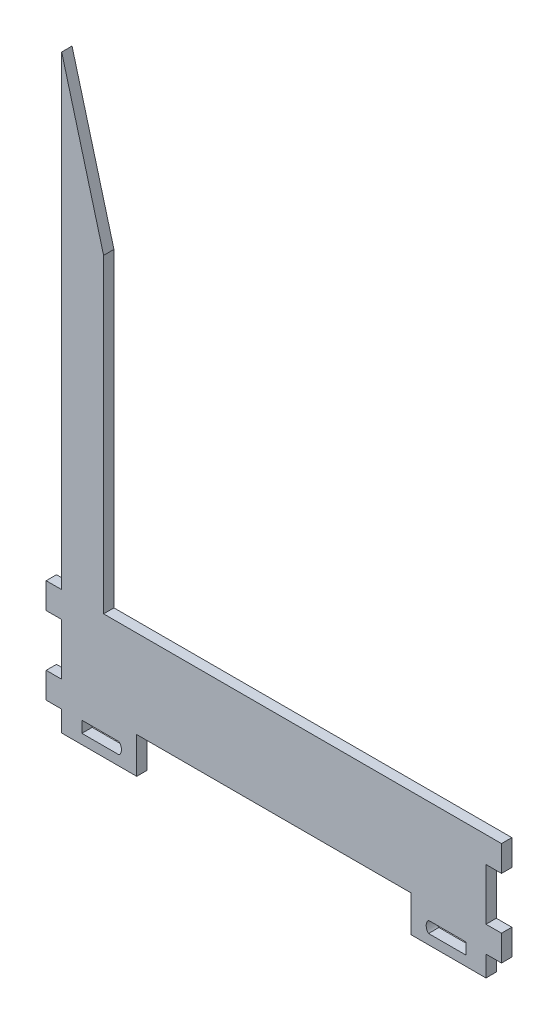
ISO-10303-21;
HEADER;
FILE_DESCRIPTION(('STEP AP214'),'2;1');
FILE_NAME('part.step','',(''),(''),'','','');
FILE_SCHEMA(('AUTOMOTIVE_DESIGN { 1 0 10303 214 1 1 1 1 }'));
ENDSEC;
DATA;
#1=APPLICATION_CONTEXT('core data for automotive mechanical design processes');
#2=APPLICATION_PROTOCOL_DEFINITION('international standard','automotive_design',2000,#1);
#3=PRODUCT_CONTEXT('',#1,'mechanical');
#4=PRODUCT('Part','Part','',(#3));
#5=PRODUCT_RELATED_PRODUCT_CATEGORY('part','',(#4));
#6=PRODUCT_DEFINITION_FORMATION('','',#4);
#7=PRODUCT_DEFINITION_CONTEXT('part definition',#1,'design');
#8=PRODUCT_DEFINITION('design','',#6,#7);
#9=PRODUCT_DEFINITION_SHAPE('','',#8);
#10=(LENGTH_UNIT() NAMED_UNIT(*) SI_UNIT(.MILLI.,.METRE.));
#11=(NAMED_UNIT(*) PLANE_ANGLE_UNIT() SI_UNIT($,.RADIAN.));
#12=(NAMED_UNIT(*) SI_UNIT($,.STERADIAN.) SOLID_ANGLE_UNIT());
#13=UNCERTAINTY_MEASURE_WITH_UNIT(LENGTH_MEASURE(1.E-05),#10,'distance_accuracy_value','');
#14=(GEOMETRIC_REPRESENTATION_CONTEXT(3) GLOBAL_UNCERTAINTY_ASSIGNED_CONTEXT((#13)) GLOBAL_UNIT_ASSIGNED_CONTEXT((#10,
#11,#12)) REPRESENTATION_CONTEXT('',''));
#15=CARTESIAN_POINT('',(0.,0.,0.));
#16=DIRECTION('',(0.,0.,1.));
#17=DIRECTION('',(1.,0.,0.));
#18=AXIS2_PLACEMENT_3D('',#15,#16,#17);
#19=CARTESIAN_POINT('',(0.,0.,2.));
#20=DIRECTION('',(0.,0.,1.));
#21=DIRECTION('',(1.,0.,0.));
#22=AXIS2_PLACEMENT_3D('',#19,#20,#21);
#23=PLANE('',#22);
#24=DIRECTION('',(1.,0.,0.));
#25=VECTOR('',#24,1.);
#26=CARTESIAN_POINT('',(40.9999999999946,0.00978331472900346,2.));
#27=LINE('',#26,#25);
#28=CARTESIAN_POINT('',(40.9999999999946,0.00978331472900346,2.));
#29=VERTEX_POINT('',#28);
#30=CARTESIAN_POINT('',(43.9999999999946,0.00978331472900346,2.));
#31=VERTEX_POINT('',#30);
#32=EDGE_CURVE('E309',#29,#31,#27,.T.);
#33=ORIENTED_EDGE('',*,*,#32,.T.);
#34=DIRECTION('',(0.,1.,0.));
#35=VECTOR('',#34,1.);
#36=CARTESIAN_POINT('',(43.9999999999946,0.00978331472900346,2.));
#37=LINE('',#36,#35);
#38=CARTESIAN_POINT('',(43.9999999999946,5.009783314729,2.));
#39=VERTEX_POINT('',#38);
#40=EDGE_CURVE('E312',#31,#39,#37,.T.);
#41=ORIENTED_EDGE('',*,*,#40,.T.);
#42=DIRECTION('',(-1.,0.,0.));
#43=VECTOR('',#42,1.);
#44=CARTESIAN_POINT('',(43.9999999999946,5.009783314729,2.));
#45=LINE('',#44,#43);
#46=CARTESIAN_POINT('',(40.9999999999946,5.009783314729,2.));
#47=VERTEX_POINT('',#46);
#48=EDGE_CURVE('E315',#39,#47,#45,.T.);
#49=ORIENTED_EDGE('',*,*,#48,.T.);
#50=DIRECTION('',(0.,1.,0.));
#51=VECTOR('',#50,1.);
#52=CARTESIAN_POINT('',(40.9999999999946,5.009783314729,2.));
#53=LINE('',#52,#51);
#54=CARTESIAN_POINT('',(40.9999999999933,15.0097833147254,2.));
#55=VERTEX_POINT('',#54);
#56=EDGE_CURVE('E317',#47,#55,#53,.T.);
#57=ORIENTED_EDGE('',*,*,#56,.T.);
#58=DIRECTION('',(1.,0.,0.));
#59=VECTOR('',#58,1.);
#60=CARTESIAN_POINT('',(40.9999999999933,15.0097833147254,2.));
#61=LINE('',#60,#59);
#62=CARTESIAN_POINT('',(43.9999999999995,15.0097833147254,2.));
#63=VERTEX_POINT('',#62);
#64=EDGE_CURVE('E319',#55,#63,#61,.T.);
#65=ORIENTED_EDGE('',*,*,#64,.T.);
#66=DIRECTION('',(0.,1.,0.));
#67=VECTOR('',#66,1.);
#68=CARTESIAN_POINT('',(43.9999999999995,15.0097833147254,2.));
#69=LINE('',#68,#67);
#70=CARTESIAN_POINT('',(43.9999999999995,20.0097833147254,2.));
#71=VERTEX_POINT('',#70);
#72=EDGE_CURVE('E321',#63,#71,#69,.T.);
#73=ORIENTED_EDGE('',*,*,#72,.T.);
#74=DIRECTION('',(-1.,0.,0.));
#75=VECTOR('',#74,1.);
#76=CARTESIAN_POINT('',(43.9999999999995,20.0097833147254,2.));
#77=LINE('',#76,#75);
#78=CARTESIAN_POINT('',(-32.8999999999918,20.0097833147254,2.));
#79=VERTEX_POINT('',#78);
#80=EDGE_CURVE('E323',#71,#79,#77,.T.);
#81=ORIENTED_EDGE('',*,*,#80,.T.);
#82=DIRECTION('',(0.,1.,0.));
#83=VECTOR('',#82,1.);
#84=CARTESIAN_POINT('',(-32.8999999999918,20.0097833147254,2.));
#85=LINE('',#84,#83);
#86=CARTESIAN_POINT('',(-32.8999999999918,80.0097833147254,2.));
#87=VERTEX_POINT('',#86);
#88=EDGE_CURVE('E325',#79,#87,#85,.T.);
#89=ORIENTED_EDGE('',*,*,#88,.T.);
#90=DIRECTION('',(-0.260736081412906,0.96541011795477,0.));
#91=VECTOR('',#90,1.);
#92=CARTESIAN_POINT('',(-32.8999999999918,80.0097833147254,2.));
#93=LINE('',#92,#91);
#94=CARTESIAN_POINT('',(-40.9999999999958,110.001113678604,2.));
#95=VERTEX_POINT('',#94);
#96=EDGE_CURVE('E327',#87,#95,#93,.T.);
#97=ORIENTED_EDGE('',*,*,#96,.T.);
#98=DIRECTION('',(0.,-1.,0.));
#99=VECTOR('',#98,1.);
#100=CARTESIAN_POINT('',(-40.9999999999958,110.001113678604,2.));
#101=LINE('',#100,#99);
#102=CARTESIAN_POINT('',(-40.9999999999958,20.0097833147254,2.));
#103=VERTEX_POINT('',#102);
#104=EDGE_CURVE('E329',#95,#103,#101,.T.);
#105=ORIENTED_EDGE('',*,*,#104,.T.);
#106=DIRECTION('',(-1.,0.,0.));
#107=VECTOR('',#106,1.);
#108=CARTESIAN_POINT('',(-43.9999999999958,20.0097833147254,2.));
#109=LINE('',#108,#107);
#110=CARTESIAN_POINT('',(-43.9999999999958,20.0097833147254,2.));
#111=VERTEX_POINT('',#110);
#112=EDGE_CURVE('E331',#103,#111,#109,.T.);
#113=ORIENTED_EDGE('',*,*,#112,.T.);
#114=DIRECTION('',(0.,-1.,0.));
#115=VECTOR('',#114,1.);
#116=CARTESIAN_POINT('',(-43.9999999999958,15.0097833147254,2.));
#117=LINE('',#116,#115);
#118=CARTESIAN_POINT('',(-43.9999999999958,15.0097833147254,2.));
#119=VERTEX_POINT('',#118);
#120=EDGE_CURVE('E333',#111,#119,#117,.T.);
#121=ORIENTED_EDGE('',*,*,#120,.T.);
#122=DIRECTION('',(1.,0.,0.));
#123=VECTOR('',#122,1.);
#124=CARTESIAN_POINT('',(-40.9999999999946,15.0097833147254,2.));
#125=LINE('',#124,#123);
#126=CARTESIAN_POINT('',(-40.9999999999946,15.0097833147254,2.));
#127=VERTEX_POINT('',#126);
#128=EDGE_CURVE('E335',#119,#127,#125,.T.);
#129=ORIENTED_EDGE('',*,*,#128,.T.);
#130=DIRECTION('',(0.,-1.,0.));
#131=VECTOR('',#130,1.);
#132=CARTESIAN_POINT('',(-40.9999999999946,10.0097833147254,2.));
#133=LINE('',#132,#131);
#134=CARTESIAN_POINT('',(-40.9999999999946,5.009783314729,2.));
#135=VERTEX_POINT('',#134);
#136=EDGE_CURVE('E337',#127,#135,#133,.T.);
#137=ORIENTED_EDGE('',*,*,#136,.T.);
#138=DIRECTION('',(-1.,0.,0.));
#139=VECTOR('',#138,1.);
#140=CARTESIAN_POINT('',(-43.9999999999946,5.009783314729,2.));
#141=LINE('',#140,#139);
#142=CARTESIAN_POINT('',(-43.9999999999946,5.009783314729,2.));
#143=VERTEX_POINT('',#142);
#144=EDGE_CURVE('E339',#135,#143,#141,.T.);
#145=ORIENTED_EDGE('',*,*,#144,.T.);
#146=DIRECTION('',(0.,-1.,0.));
#147=VECTOR('',#146,1.);
#148=CARTESIAN_POINT('',(-43.9999999999946,0.00978331472900346,2.));
#149=LINE('',#148,#147);
#150=CARTESIAN_POINT('',(-43.9999999999946,0.00978331472900346,2.));
#151=VERTEX_POINT('',#150);
#152=EDGE_CURVE('E341',#143,#151,#149,.T.);
#153=ORIENTED_EDGE('',*,*,#152,.T.);
#154=DIRECTION('',(1.,0.,0.));
#155=VECTOR('',#154,1.);
#156=CARTESIAN_POINT('',(-40.9999999999946,0.00978331472900346,2.));
#157=LINE('',#156,#155);
#158=CARTESIAN_POINT('',(-40.9999999999946,0.00978331472900346,2.));
#159=VERTEX_POINT('',#158);
#160=EDGE_CURVE('E343',#151,#159,#157,.T.);
#161=ORIENTED_EDGE('',*,*,#160,.T.);
#162=DIRECTION('',(0.,-1.,0.));
#163=VECTOR('',#162,1.);
#164=CARTESIAN_POINT('',(-40.9999999999946,0.00978331472900346,2.));
#165=LINE('',#164,#163);
#166=CARTESIAN_POINT('',(-40.9999999999946,-3.990216685271,2.));
#167=VERTEX_POINT('',#166);
#168=EDGE_CURVE('E345',#159,#167,#165,.T.);
#169=ORIENTED_EDGE('',*,*,#168,.T.);
#170=DIRECTION('',(1.,0.,0.));
#171=VECTOR('',#170,1.);
#172=CARTESIAN_POINT('',(-26.4999999999946,-3.990216685271,2.));
#173=LINE('',#172,#171);
#174=CARTESIAN_POINT('',(-26.4999999999946,-3.990216685271,2.));
#175=VERTEX_POINT('',#174);
#176=EDGE_CURVE('E347',#167,#175,#173,.T.);
#177=ORIENTED_EDGE('',*,*,#176,.T.);
#178=DIRECTION('',(0.,1.,0.));
#179=VECTOR('',#178,1.);
#180=CARTESIAN_POINT('',(-26.4999999999946,3.009783314729,2.));
#181=LINE('',#180,#179);
#182=CARTESIAN_POINT('',(-26.4999999999946,3.009783314729,2.));
#183=VERTEX_POINT('',#182);
#184=EDGE_CURVE('E349',#175,#183,#181,.T.);
#185=ORIENTED_EDGE('',*,*,#184,.T.);
#186=DIRECTION('',(1.,0.,0.));
#187=VECTOR('',#186,1.);
#188=CARTESIAN_POINT('',(-26.4999999999946,3.009783314729,2.));
#189=LINE('',#188,#187);
#190=CARTESIAN_POINT('',(26.4999999999946,3.009783314729,2.));
#191=VERTEX_POINT('',#190);
#192=EDGE_CURVE('E351',#183,#191,#189,.T.);
#193=ORIENTED_EDGE('',*,*,#192,.T.);
#194=DIRECTION('',(0.,-1.,0.));
#195=VECTOR('',#194,1.);
#196=CARTESIAN_POINT('',(26.4999999999946,-3.990216685271,2.));
#197=LINE('',#196,#195);
#198=CARTESIAN_POINT('',(26.4999999999946,-3.990216685271,2.));
#199=VERTEX_POINT('',#198);
#200=EDGE_CURVE('E353',#191,#199,#197,.T.);
#201=ORIENTED_EDGE('',*,*,#200,.T.);
#202=DIRECTION('',(1.,0.,0.));
#203=VECTOR('',#202,1.);
#204=CARTESIAN_POINT('',(40.9999999999946,-3.990216685271,2.));
#205=LINE('',#204,#203);
#206=CARTESIAN_POINT('',(40.9999999999946,-3.990216685271,2.));
#207=VERTEX_POINT('',#206);
#208=EDGE_CURVE('E355',#199,#207,#205,.T.);
#209=ORIENTED_EDGE('',*,*,#208,.T.);
#210=DIRECTION('',(0.,1.,0.));
#211=VECTOR('',#210,1.);
#212=CARTESIAN_POINT('',(40.9999999999946,0.00978331472900346,2.));
#213=LINE('',#212,#211);
#214=EDGE_CURVE('E357',#207,#29,#213,.T.);
#215=ORIENTED_EDGE('',*,*,#214,.T.);
#216=EDGE_LOOP('',(#33,#41,#49,#57,#65,#73,#81,#89,#97,#105,#113,#121,#129,#137,#145,#153,#161,
#169,#177,#185,#193,#201,#209,#215));
#217=FACE_BOUND('',#216,.T.);
#218=DIRECTION('',(1.,0.,0.));
#219=VECTOR('',#218,1.);
#220=CARTESIAN_POINT('',(-37.0999999999946,-2.090216685271,2.));
#221=LINE('',#220,#219);
#222=CARTESIAN_POINT('',(-37.0999999999946,-2.090216685271,2.));
#223=VERTEX_POINT('',#222);
#224=CARTESIAN_POINT('',(-29.8999999999946,-2.090216685271,2.));
#225=VERTEX_POINT('',#224);
#226=EDGE_CURVE('E280',#223,#225,#221,.T.);
#227=ORIENTED_EDGE('',*,*,#226,.F.);
#228=DIRECTION('',(0.,-1.,0.));
#229=VECTOR('',#228,1.);
#230=CARTESIAN_POINT('',(-37.0999999999946,-2.090216685271,2.));
#231=LINE('',#230,#229);
#232=CARTESIAN_POINT('',(-37.0999999999946,0.109783314729003,2.));
#233=VERTEX_POINT('',#232);
#234=EDGE_CURVE('E278',#233,#223,#231,.T.);
#235=ORIENTED_EDGE('',*,*,#234,.F.);
#236=DIRECTION('',(-1.,0.,0.));
#237=VECTOR('',#236,1.);
#238=CARTESIAN_POINT('',(-37.0999999999946,0.109783314729003,2.));
#239=LINE('',#238,#237);
#240=CARTESIAN_POINT('',(-29.8999999999946,0.109783314729003,2.));
#241=VERTEX_POINT('',#240);
#242=EDGE_CURVE('E286',#241,#233,#239,.T.);
#243=ORIENTED_EDGE('',*,*,#242,.F.);
#244=CARTESIAN_POINT('',(-30.9999999999946,-0.990216685270997,2.));
#245=DIRECTION('',(0.,0.,1.));
#246=DIRECTION('',(1.,0.,0.));
#247=AXIS2_PLACEMENT_3D('',#244,#245,#246);
#248=CIRCLE('',#247,1.55563491861041);
#249=EDGE_CURVE('E283',#225,#241,#248,.T.);
#250=ORIENTED_EDGE('',*,*,#249,.F.);
#251=EDGE_LOOP('',(#227,#235,#243,#250));
#252=FACE_BOUND('',#251,.T.);
#253=DIRECTION('',(1.,0.,0.));
#254=VECTOR('',#253,1.);
#255=CARTESIAN_POINT('',(37.0999999999946,-2.090216685271,2.));
#256=LINE('',#255,#254);
#257=CARTESIAN_POINT('',(29.8999999999946,-2.090216685271,2.));
#258=VERTEX_POINT('',#257);
#259=CARTESIAN_POINT('',(37.0999999999946,-2.090216685271,2.));
#260=VERTEX_POINT('',#259);
#261=EDGE_CURVE('E250',#258,#260,#256,.T.);
#262=ORIENTED_EDGE('',*,*,#261,.F.);
#263=CARTESIAN_POINT('',(30.9999999999946,-0.990216685270997,2.));
#264=DIRECTION('',(0.,0.,1.));
#265=DIRECTION('',(1.,0.,0.));
#266=AXIS2_PLACEMENT_3D('',#263,#264,#265);
#267=CIRCLE('',#266,1.5556349186104);
#268=CARTESIAN_POINT('',(29.8999999999946,0.109783314729003,2.));
#269=VERTEX_POINT('',#268);
#270=EDGE_CURVE('E242',#269,#258,#267,.T.);
#271=ORIENTED_EDGE('',*,*,#270,.F.);
#272=DIRECTION('',(-1.,0.,0.));
#273=VECTOR('',#272,1.);
#274=CARTESIAN_POINT('',(37.0999999999946,0.109783314729003,2.));
#275=LINE('',#274,#273);
#276=CARTESIAN_POINT('',(37.0999999999946,0.109783314729003,2.));
#277=VERTEX_POINT('',#276);
#278=EDGE_CURVE('E264',#277,#269,#275,.T.);
#279=ORIENTED_EDGE('',*,*,#278,.F.);
#280=DIRECTION('',(0.,1.,0.));
#281=VECTOR('',#280,1.);
#282=CARTESIAN_POINT('',(37.0999999999946,-2.090216685271,2.));
#283=LINE('',#282,#281);
#284=EDGE_CURVE('E262',#260,#277,#283,.T.);
#285=ORIENTED_EDGE('',*,*,#284,.F.);
#286=EDGE_LOOP('',(#262,#271,#279,#285));
#287=FACE_BOUND('',#286,.T.);
#288=ADVANCED_FACE('F33',(#217,#252,#287),#23,.T.);
#289=CARTESIAN_POINT('',(0.,0.,0.));
#290=DIRECTION('',(0.,0.,1.));
#291=DIRECTION('',(1.,0.,0.));
#292=AXIS2_PLACEMENT_3D('',#289,#290,#291);
#293=PLANE('',#292);
#294=DIRECTION('',(0.,-1.,0.));
#295=VECTOR('',#294,1.);
#296=CARTESIAN_POINT('',(-37.0999999999946,-2.090216685271,0.));
#297=LINE('',#296,#295);
#298=CARTESIAN_POINT('',(-37.0999999999946,0.109783314729003,0.));
#299=VERTEX_POINT('',#298);
#300=CARTESIAN_POINT('',(-37.0999999999946,-2.090216685271,0.));
#301=VERTEX_POINT('',#300);
#302=EDGE_CURVE('E258',#299,#301,#297,.T.);
#303=ORIENTED_EDGE('',*,*,#302,.T.);
#304=DIRECTION('',(1.,0.,0.));
#305=VECTOR('',#304,1.);
#306=CARTESIAN_POINT('',(-37.0999999999946,-2.090216685271,0.));
#307=LINE('',#306,#305);
#308=CARTESIAN_POINT('',(-29.8999999999946,-2.090216685271,0.));
#309=VERTEX_POINT('',#308);
#310=EDGE_CURVE('E291',#301,#309,#307,.T.);
#311=ORIENTED_EDGE('',*,*,#310,.T.);
#312=CARTESIAN_POINT('',(-30.9999999999946,-0.990216685270997,0.));
#313=DIRECTION('',(0.,0.,1.));
#314=DIRECTION('',(1.,0.,0.));
#315=AXIS2_PLACEMENT_3D('',#312,#313,#314);
#316=CIRCLE('',#315,1.55563491861041);
#317=CARTESIAN_POINT('',(-29.8999999999946,0.109783314729003,0.));
#318=VERTEX_POINT('',#317);
#319=EDGE_CURVE('E294',#309,#318,#316,.T.);
#320=ORIENTED_EDGE('',*,*,#319,.T.);
#321=DIRECTION('',(-1.,0.,0.));
#322=VECTOR('',#321,1.);
#323=CARTESIAN_POINT('',(-37.0999999999946,0.109783314729003,0.));
#324=LINE('',#323,#322);
#325=EDGE_CURVE('E281',#318,#299,#324,.T.);
#326=ORIENTED_EDGE('',*,*,#325,.T.);
#327=EDGE_LOOP('',(#303,#311,#320,#326));
#328=FACE_BOUND('',#327,.T.);
#329=DIRECTION('',(1.,0.,0.));
#330=VECTOR('',#329,1.);
#331=CARTESIAN_POINT('',(40.9999999999946,0.00978331472900346,0.));
#332=LINE('',#331,#330);
#333=CARTESIAN_POINT('',(40.9999999999946,0.00978331472900346,0.));
#334=VERTEX_POINT('',#333);
#335=CARTESIAN_POINT('',(43.9999999999946,0.00978331472900346,0.));
#336=VERTEX_POINT('',#335);
#337=EDGE_CURVE('E308',#334,#336,#332,.T.);
#338=ORIENTED_EDGE('',*,*,#337,.F.);
#339=DIRECTION('',(0.,1.,0.));
#340=VECTOR('',#339,1.);
#341=CARTESIAN_POINT('',(40.9999999999946,0.00978331472900346,0.));
#342=LINE('',#341,#340);
#343=CARTESIAN_POINT('',(40.9999999999946,-3.990216685271,0.));
#344=VERTEX_POINT('',#343);
#345=EDGE_CURVE('E313',#344,#334,#342,.T.);
#346=ORIENTED_EDGE('',*,*,#345,.F.);
#347=DIRECTION('',(1.,0.,0.));
#348=VECTOR('',#347,1.);
#349=CARTESIAN_POINT('',(40.9999999999946,-3.990216685271,0.));
#350=LINE('',#349,#348);
#351=CARTESIAN_POINT('',(26.4999999999946,-3.990216685271,0.));
#352=VERTEX_POINT('',#351);
#353=EDGE_CURVE('E408',#352,#344,#350,.T.);
#354=ORIENTED_EDGE('',*,*,#353,.F.);
#355=DIRECTION('',(0.,-1.,0.));
#356=VECTOR('',#355,1.);
#357=CARTESIAN_POINT('',(26.4999999999946,-3.990216685271,0.));
#358=LINE('',#357,#356);
#359=CARTESIAN_POINT('',(26.4999999999946,3.009783314729,0.));
#360=VERTEX_POINT('',#359);
#361=EDGE_CURVE('E406',#360,#352,#358,.T.);
#362=ORIENTED_EDGE('',*,*,#361,.F.);
#363=DIRECTION('',(1.,0.,0.));
#364=VECTOR('',#363,1.);
#365=CARTESIAN_POINT('',(-26.4999999999946,3.009783314729,0.));
#366=LINE('',#365,#364);
#367=CARTESIAN_POINT('',(-26.4999999999946,3.009783314729,0.));
#368=VERTEX_POINT('',#367);
#369=EDGE_CURVE('E404',#368,#360,#366,.T.);
#370=ORIENTED_EDGE('',*,*,#369,.F.);
#371=DIRECTION('',(0.,1.,0.));
#372=VECTOR('',#371,1.);
#373=CARTESIAN_POINT('',(-26.4999999999946,3.009783314729,0.));
#374=LINE('',#373,#372);
#375=CARTESIAN_POINT('',(-26.4999999999946,-3.990216685271,0.));
#376=VERTEX_POINT('',#375);
#377=EDGE_CURVE('E402',#376,#368,#374,.T.);
#378=ORIENTED_EDGE('',*,*,#377,.F.);
#379=DIRECTION('',(1.,0.,0.));
#380=VECTOR('',#379,1.);
#381=CARTESIAN_POINT('',(-26.4999999999946,-3.990216685271,0.));
#382=LINE('',#381,#380);
#383=CARTESIAN_POINT('',(-40.9999999999946,-3.990216685271,0.));
#384=VERTEX_POINT('',#383);
#385=EDGE_CURVE('E400',#384,#376,#382,.T.);
#386=ORIENTED_EDGE('',*,*,#385,.F.);
#387=DIRECTION('',(0.,-1.,0.));
#388=VECTOR('',#387,1.);
#389=CARTESIAN_POINT('',(-40.9999999999946,0.00978331472900346,0.));
#390=LINE('',#389,#388);
#391=CARTESIAN_POINT('',(-40.9999999999946,0.00978331472900346,0.));
#392=VERTEX_POINT('',#391);
#393=EDGE_CURVE('E398',#392,#384,#390,.T.);
#394=ORIENTED_EDGE('',*,*,#393,.F.);
#395=DIRECTION('',(1.,0.,0.));
#396=VECTOR('',#395,1.);
#397=CARTESIAN_POINT('',(-40.9999999999946,0.00978331472900346,0.));
#398=LINE('',#397,#396);
#399=CARTESIAN_POINT('',(-43.9999999999946,0.00978331472900346,0.));
#400=VERTEX_POINT('',#399);
#401=EDGE_CURVE('E396',#400,#392,#398,.T.);
#402=ORIENTED_EDGE('',*,*,#401,.F.);
#403=DIRECTION('',(0.,-1.,0.));
#404=VECTOR('',#403,1.);
#405=CARTESIAN_POINT('',(-43.9999999999946,0.00978331472900346,0.));
#406=LINE('',#405,#404);
#407=CARTESIAN_POINT('',(-43.9999999999946,5.009783314729,0.));
#408=VERTEX_POINT('',#407);
#409=EDGE_CURVE('E394',#408,#400,#406,.T.);
#410=ORIENTED_EDGE('',*,*,#409,.F.);
#411=DIRECTION('',(-1.,0.,0.));
#412=VECTOR('',#411,1.);
#413=CARTESIAN_POINT('',(-43.9999999999946,5.009783314729,0.));
#414=LINE('',#413,#412);
#415=CARTESIAN_POINT('',(-40.9999999999946,5.009783314729,0.));
#416=VERTEX_POINT('',#415);
#417=EDGE_CURVE('E392',#416,#408,#414,.T.);
#418=ORIENTED_EDGE('',*,*,#417,.F.);
#419=DIRECTION('',(0.,-1.,0.));
#420=VECTOR('',#419,1.);
#421=CARTESIAN_POINT('',(-40.9999999999946,5.009783314729,0.));
#422=LINE('',#421,#420);
#423=CARTESIAN_POINT('',(-40.9999999999946,15.0097833147254,0.));
#424=VERTEX_POINT('',#423);
#425=EDGE_CURVE('E390',#424,#416,#422,.T.);
#426=ORIENTED_EDGE('',*,*,#425,.F.);
#427=DIRECTION('',(1.,0.,0.));
#428=VECTOR('',#427,1.);
#429=CARTESIAN_POINT('',(-40.9999999999946,15.0097833147254,0.));
#430=LINE('',#429,#428);
#431=CARTESIAN_POINT('',(-43.9999999999958,15.0097833147254,0.));
#432=VERTEX_POINT('',#431);
#433=EDGE_CURVE('E387',#432,#424,#430,.T.);
#434=ORIENTED_EDGE('',*,*,#433,.F.);
#435=DIRECTION('',(0.,-1.,0.));
#436=VECTOR('',#435,1.);
#437=CARTESIAN_POINT('',(-43.9999999999958,15.0097833147254,0.));
#438=LINE('',#437,#436);
#439=CARTESIAN_POINT('',(-43.9999999999958,20.0097833147254,0.));
#440=VERTEX_POINT('',#439);
#441=EDGE_CURVE('E385',#440,#432,#438,.T.);
#442=ORIENTED_EDGE('',*,*,#441,.F.);
#443=DIRECTION('',(-1.,0.,0.));
#444=VECTOR('',#443,1.);
#445=CARTESIAN_POINT('',(-43.9999999999958,20.0097833147254,0.));
#446=LINE('',#445,#444);
#447=CARTESIAN_POINT('',(-40.9999999999958,20.0097833147254,0.));
#448=VERTEX_POINT('',#447);
#449=EDGE_CURVE('E383',#448,#440,#446,.T.);
#450=ORIENTED_EDGE('',*,*,#449,.F.);
#451=DIRECTION('',(0.,-1.,0.));
#452=VECTOR('',#451,1.);
#453=CARTESIAN_POINT('',(-40.9999999999958,20.0097833147254,0.));
#454=LINE('',#453,#452);
#455=CARTESIAN_POINT('',(-40.9999999999958,110.001113678604,0.));
#456=VERTEX_POINT('',#455);
#457=EDGE_CURVE('E381',#456,#448,#454,.T.);
#458=ORIENTED_EDGE('',*,*,#457,.F.);
#459=DIRECTION('',(-0.260736081412906,0.96541011795477,0.));
#460=VECTOR('',#459,1.);
#461=CARTESIAN_POINT('',(-32.8999999999918,80.0097833147254,0.));
#462=LINE('',#461,#460);
#463=CARTESIAN_POINT('',(-32.8999999999918,80.0097833147254,0.));
#464=VERTEX_POINT('',#463);
#465=EDGE_CURVE('E378',#464,#456,#462,.T.);
#466=ORIENTED_EDGE('',*,*,#465,.F.);
#467=DIRECTION('',(0.,1.,0.));
#468=VECTOR('',#467,1.);
#469=CARTESIAN_POINT('',(-32.8999999999918,20.0097833147254,0.));
#470=LINE('',#469,#468);
#471=CARTESIAN_POINT('',(-32.8999999999918,20.0097833147254,0.));
#472=VERTEX_POINT('',#471);
#473=EDGE_CURVE('E376',#472,#464,#470,.T.);
#474=ORIENTED_EDGE('',*,*,#473,.F.);
#475=DIRECTION('',(-1.,0.,0.));
#476=VECTOR('',#475,1.);
#477=CARTESIAN_POINT('',(40.9999999999933,20.0097833147254,0.));
#478=LINE('',#477,#476);
#479=CARTESIAN_POINT('',(43.9999999999995,20.0097833147254,0.));
#480=VERTEX_POINT('',#479);
#481=EDGE_CURVE('E374',#480,#472,#478,.T.);
#482=ORIENTED_EDGE('',*,*,#481,.F.);
#483=DIRECTION('',(0.,1.,0.));
#484=VECTOR('',#483,1.);
#485=CARTESIAN_POINT('',(43.9999999999995,15.0097833147254,0.));
#486=LINE('',#485,#484);
#487=CARTESIAN_POINT('',(43.9999999999995,15.0097833147254,0.));
#488=VERTEX_POINT('',#487);
#489=EDGE_CURVE('E371',#488,#480,#486,.T.);
#490=ORIENTED_EDGE('',*,*,#489,.F.);
#491=DIRECTION('',(1.,0.,0.));
#492=VECTOR('',#491,1.);
#493=CARTESIAN_POINT('',(40.9999999999933,15.0097833147254,0.));
#494=LINE('',#493,#492);
#495=CARTESIAN_POINT('',(40.9999999999933,15.0097833147254,0.));
#496=VERTEX_POINT('',#495);
#497=EDGE_CURVE('E369',#496,#488,#494,.T.);
#498=ORIENTED_EDGE('',*,*,#497,.F.);
#499=DIRECTION('',(0.,1.,0.));
#500=VECTOR('',#499,1.);
#501=CARTESIAN_POINT('',(40.9999999999933,10.0097833147254,0.));
#502=LINE('',#501,#500);
#503=CARTESIAN_POINT('',(40.9999999999946,5.009783314729,0.));
#504=VERTEX_POINT('',#503);
#505=EDGE_CURVE('E367',#504,#496,#502,.T.);
#506=ORIENTED_EDGE('',*,*,#505,.F.);
#507=DIRECTION('',(-1.,0.,0.));
#508=VECTOR('',#507,1.);
#509=CARTESIAN_POINT('',(43.9999999999946,5.009783314729,0.));
#510=LINE('',#509,#508);
#511=CARTESIAN_POINT('',(43.9999999999946,5.009783314729,0.));
#512=VERTEX_POINT('',#511);
#513=EDGE_CURVE('E364',#512,#504,#510,.T.);
#514=ORIENTED_EDGE('',*,*,#513,.F.);
#515=DIRECTION('',(0.,1.,0.));
#516=VECTOR('',#515,1.);
#517=CARTESIAN_POINT('',(43.9999999999946,0.00978331472900346,0.));
#518=LINE('',#517,#516);
#519=EDGE_CURVE('E362',#336,#512,#518,.T.);
#520=ORIENTED_EDGE('',*,*,#519,.F.);
#521=EDGE_LOOP('',(#338,#346,#354,#362,#370,#378,#386,#394,#402,#410,#418,#426,#434,#442,#450,
#458,#466,#474,#482,#490,#498,#506,#514,#520));
#522=FACE_BOUND('',#521,.T.);
#523=CARTESIAN_POINT('',(30.9999999999946,-0.990216685270997,0.));
#524=DIRECTION('',(0.,0.,1.));
#525=DIRECTION('',(1.,0.,0.));
#526=AXIS2_PLACEMENT_3D('',#523,#524,#525);
#527=CIRCLE('',#526,1.5556349186104);
#528=CARTESIAN_POINT('',(29.8999999999946,0.109783314729003,0.));
#529=VERTEX_POINT('',#528);
#530=CARTESIAN_POINT('',(29.8999999999946,-2.090216685271,0.));
#531=VERTEX_POINT('',#530);
#532=EDGE_CURVE('E56',#529,#531,#527,.T.);
#533=ORIENTED_EDGE('',*,*,#532,.T.);
#534=DIRECTION('',(1.,0.,0.));
#535=VECTOR('',#534,1.);
#536=CARTESIAN_POINT('',(37.0999999999946,-2.090216685271,0.));
#537=LINE('',#536,#535);
#538=CARTESIAN_POINT('',(37.0999999999946,-2.090216685271,0.));
#539=VERTEX_POINT('',#538);
#540=EDGE_CURVE('E257',#531,#539,#537,.T.);
#541=ORIENTED_EDGE('',*,*,#540,.T.);
#542=DIRECTION('',(0.,1.,0.));
#543=VECTOR('',#542,1.);
#544=CARTESIAN_POINT('',(37.0999999999946,-2.090216685271,0.));
#545=LINE('',#544,#543);
#546=CARTESIAN_POINT('',(37.0999999999946,0.109783314729003,0.));
#547=VERTEX_POINT('',#546);
#548=EDGE_CURVE('E270',#539,#547,#545,.T.);
#549=ORIENTED_EDGE('',*,*,#548,.T.);
#550=DIRECTION('',(-1.,0.,0.));
#551=VECTOR('',#550,1.);
#552=CARTESIAN_POINT('',(37.0999999999946,0.109783314729003,0.));
#553=LINE('',#552,#551);
#554=EDGE_CURVE('E251',#547,#529,#553,.T.);
#555=ORIENTED_EDGE('',*,*,#554,.T.);
#556=EDGE_LOOP('',(#533,#541,#549,#555));
#557=FACE_BOUND('',#556,.T.);
#558=ADVANCED_FACE('F485',(#328,#522,#557),#293,.F.);
#559=CARTESIAN_POINT('',(40.9999999999946,0.00978331472900346,2.));
#560=DIRECTION('',(0.,1.,0.));
#561=DIRECTION('',(0.,0.,1.));
#562=AXIS2_PLACEMENT_3D('',#559,#560,#561);
#563=PLANE('',#562);
#564=ORIENTED_EDGE('',*,*,#337,.T.);
#565=DIRECTION('',(0.,0.,-1.));
#566=VECTOR('',#565,1.);
#567=CARTESIAN_POINT('',(43.9999999999946,0.00978331472900346,2.));
#568=LINE('',#567,#566);
#569=EDGE_CURVE('E11',#31,#336,#568,.T.);
#570=ORIENTED_EDGE('',*,*,#569,.F.);
#571=ORIENTED_EDGE('',*,*,#32,.F.);
#572=DIRECTION('',(0.,0.,-1.));
#573=VECTOR('',#572,1.);
#574=CARTESIAN_POINT('',(40.9999999999946,0.00978331472900346,2.));
#575=LINE('',#574,#573);
#576=EDGE_CURVE('E359',#29,#334,#575,.T.);
#577=ORIENTED_EDGE('',*,*,#576,.T.);
#578=EDGE_LOOP('',(#564,#570,#571,#577));
#579=FACE_BOUND('',#578,.T.);
#580=ADVANCED_FACE('F35',(#579),#563,.F.);
#581=CARTESIAN_POINT('',(43.9999999999946,0.00978331472900346,2.));
#582=DIRECTION('',(-1.,0.,0.));
#583=DIRECTION('',(0.,0.,1.));
#584=AXIS2_PLACEMENT_3D('',#581,#582,#583);
#585=PLANE('',#584);
#586=ORIENTED_EDGE('',*,*,#519,.T.);
#587=DIRECTION('',(0.,0.,-1.));
#588=VECTOR('',#587,1.);
#589=CARTESIAN_POINT('',(43.9999999999946,5.009783314729,2.));
#590=LINE('',#589,#588);
#591=EDGE_CURVE('E41',#39,#512,#590,.T.);
#592=ORIENTED_EDGE('',*,*,#591,.F.);
#593=ORIENTED_EDGE('',*,*,#40,.F.);
#594=ORIENTED_EDGE('',*,*,#569,.T.);
#595=EDGE_LOOP('',(#586,#592,#593,#594));
#596=FACE_BOUND('',#595,.T.);
#597=ADVANCED_FACE('F503',(#596),#585,.F.);
#598=CARTESIAN_POINT('',(43.9999999999946,5.009783314729,2.));
#599=DIRECTION('',(0.,-1.,0.));
#600=DIRECTION('',(0.,0.,-1.));
#601=AXIS2_PLACEMENT_3D('',#598,#599,#600);
#602=PLANE('',#601);
#603=ORIENTED_EDGE('',*,*,#513,.T.);
#604=DIRECTION('',(0.,0.,-1.));
#605=VECTOR('',#604,1.);
#606=CARTESIAN_POINT('',(40.9999999999946,5.009783314729,2.));
#607=LINE('',#606,#605);
#608=EDGE_CURVE('E473',#47,#504,#607,.T.);
#609=ORIENTED_EDGE('',*,*,#608,.F.);
#610=ORIENTED_EDGE('',*,*,#48,.F.);
#611=ORIENTED_EDGE('',*,*,#591,.T.);
#612=EDGE_LOOP('',(#603,#609,#610,#611));
#613=FACE_BOUND('',#612,.T.);
#614=ADVANCED_FACE('F480',(#613),#602,.F.);
#615=CARTESIAN_POINT('',(40.9999999999933,10.0097833147254,2.));
#616=DIRECTION('',(-1.,0.,0.));
#617=DIRECTION('',(0.,0.,1.));
#618=AXIS2_PLACEMENT_3D('',#615,#616,#617);
#619=PLANE('',#618);
#620=ORIENTED_EDGE('',*,*,#505,.T.);
#621=DIRECTION('',(0.,0.,-1.));
#622=VECTOR('',#621,1.);
#623=CARTESIAN_POINT('',(40.9999999999933,15.0097833147254,2.));
#624=LINE('',#623,#622);
#625=EDGE_CURVE('E470',#55,#496,#624,.T.);
#626=ORIENTED_EDGE('',*,*,#625,.F.);
#627=ORIENTED_EDGE('',*,*,#56,.F.);
#628=ORIENTED_EDGE('',*,*,#608,.T.);
#629=EDGE_LOOP('',(#620,#626,#627,#628));
#630=FACE_BOUND('',#629,.T.);
#631=ADVANCED_FACE('F491',(#630),#619,.F.);
#632=CARTESIAN_POINT('',(40.9999999999933,15.0097833147254,2.));
#633=DIRECTION('',(0.,1.,0.));
#634=DIRECTION('',(-1.,0.,0.));
#635=AXIS2_PLACEMENT_3D('',#632,#633,#634);
#636=PLANE('',#635);
#637=ORIENTED_EDGE('',*,*,#497,.T.);
#638=DIRECTION('',(0.,0.,-1.));
#639=VECTOR('',#638,1.);
#640=CARTESIAN_POINT('',(43.9999999999995,15.0097833147254,2.));
#641=LINE('',#640,#639);
#642=EDGE_CURVE('E467',#63,#488,#641,.T.);
#643=ORIENTED_EDGE('',*,*,#642,.F.);
#644=ORIENTED_EDGE('',*,*,#64,.F.);
#645=ORIENTED_EDGE('',*,*,#625,.T.);
#646=EDGE_LOOP('',(#637,#643,#644,#645));
#647=FACE_BOUND('',#646,.T.);
#648=ADVANCED_FACE('F495',(#647),#636,.F.);
#649=CARTESIAN_POINT('',(43.9999999999995,15.0097833147254,2.));
#650=DIRECTION('',(-1.,0.,0.));
#651=DIRECTION('',(0.,0.,1.));
#652=AXIS2_PLACEMENT_3D('',#649,#650,#651);
#653=PLANE('',#652);
#654=ORIENTED_EDGE('',*,*,#489,.T.);
#655=DIRECTION('',(0.,0.,-1.));
#656=VECTOR('',#655,1.);
#657=CARTESIAN_POINT('',(43.9999999999995,20.0097833147254,2.));
#658=LINE('',#657,#656);
#659=EDGE_CURVE('E464',#71,#480,#658,.T.);
#660=ORIENTED_EDGE('',*,*,#659,.F.);
#661=ORIENTED_EDGE('',*,*,#72,.F.);
#662=ORIENTED_EDGE('',*,*,#642,.T.);
#663=EDGE_LOOP('',(#654,#660,#661,#662));
#664=FACE_BOUND('',#663,.T.);
#665=ADVANCED_FACE('F591',(#664),#653,.F.);
#666=CARTESIAN_POINT('',(40.9999999999933,20.0097833147254,2.));
#667=DIRECTION('',(0.,-1.,0.));
#668=DIRECTION('',(1.,0.,0.));
#669=AXIS2_PLACEMENT_3D('',#666,#667,#668);
#670=PLANE('',#669);
#671=ORIENTED_EDGE('',*,*,#481,.T.);
#672=DIRECTION('',(0.,0.,-1.));
#673=VECTOR('',#672,1.);
#674=CARTESIAN_POINT('',(-32.8999999999918,20.0097833147254,2.));
#675=LINE('',#674,#673);
#676=EDGE_CURVE('E461',#79,#472,#675,.T.);
#677=ORIENTED_EDGE('',*,*,#676,.F.);
#678=ORIENTED_EDGE('',*,*,#80,.F.);
#679=ORIENTED_EDGE('',*,*,#659,.T.);
#680=EDGE_LOOP('',(#671,#677,#678,#679));
#681=FACE_BOUND('',#680,.T.);
#682=ADVANCED_FACE('F593',(#681),#670,.F.);
#683=CARTESIAN_POINT('',(-32.8999999999918,20.0097833147254,2.));
#684=DIRECTION('',(-1.,0.,0.));
#685=DIRECTION('',(0.,-1.,0.));
#686=AXIS2_PLACEMENT_3D('',#683,#684,#685);
#687=PLANE('',#686);
#688=ORIENTED_EDGE('',*,*,#473,.T.);
#689=DIRECTION('',(0.,0.,-1.));
#690=VECTOR('',#689,1.);
#691=CARTESIAN_POINT('',(-32.8999999999918,80.0097833147254,2.));
#692=LINE('',#691,#690);
#693=EDGE_CURVE('E458',#87,#464,#692,.T.);
#694=ORIENTED_EDGE('',*,*,#693,.F.);
#695=ORIENTED_EDGE('',*,*,#88,.F.);
#696=ORIENTED_EDGE('',*,*,#676,.T.);
#697=EDGE_LOOP('',(#688,#694,#695,#696));
#698=FACE_BOUND('',#697,.T.);
#699=ADVANCED_FACE('F587',(#698),#687,.F.);
#700=CARTESIAN_POINT('',(-32.8999999999918,80.0097833147254,2.));
#701=DIRECTION('',(-0.96541011795477,-0.260736081412906,0.));
#702=DIRECTION('',(0.260736081412906,-0.96541011795477,0.));
#703=AXIS2_PLACEMENT_3D('',#700,#701,#702);
#704=PLANE('',#703);
#705=ORIENTED_EDGE('',*,*,#465,.T.);
#706=DIRECTION('',(0.,0.,-1.));
#707=VECTOR('',#706,1.);
#708=CARTESIAN_POINT('',(-40.9999999999958,110.001113678604,2.));
#709=LINE('',#708,#707);
#710=EDGE_CURVE('E455',#95,#456,#709,.T.);
#711=ORIENTED_EDGE('',*,*,#710,.F.);
#712=ORIENTED_EDGE('',*,*,#96,.F.);
#713=ORIENTED_EDGE('',*,*,#693,.T.);
#714=EDGE_LOOP('',(#705,#711,#712,#713));
#715=FACE_BOUND('',#714,.T.);
#716=ADVANCED_FACE('F582',(#715),#704,.F.);
#717=CARTESIAN_POINT('',(-40.9999999999958,20.0097833147254,2.));
#718=DIRECTION('',(1.,0.,0.));
#719=DIRECTION('',(0.,1.,0.));
#720=AXIS2_PLACEMENT_3D('',#717,#718,#719);
#721=PLANE('',#720);
#722=ORIENTED_EDGE('',*,*,#457,.T.);
#723=DIRECTION('',(0.,0.,-1.));
#724=VECTOR('',#723,1.);
#725=CARTESIAN_POINT('',(-40.9999999999958,20.0097833147254,2.));
#726=LINE('',#725,#724);
#727=EDGE_CURVE('E452',#103,#448,#726,.T.);
#728=ORIENTED_EDGE('',*,*,#727,.F.);
#729=ORIENTED_EDGE('',*,*,#104,.F.);
#730=ORIENTED_EDGE('',*,*,#710,.T.);
#731=EDGE_LOOP('',(#722,#728,#729,#730));
#732=FACE_BOUND('',#731,.T.);
#733=ADVANCED_FACE('F577',(#732),#721,.F.);
#734=CARTESIAN_POINT('',(-43.9999999999958,20.0097833147254,2.));
#735=DIRECTION('',(0.,-1.,0.));
#736=DIRECTION('',(0.,0.,-1.));
#737=AXIS2_PLACEMENT_3D('',#734,#735,#736);
#738=PLANE('',#737);
#739=ORIENTED_EDGE('',*,*,#449,.T.);
#740=DIRECTION('',(0.,0.,-1.));
#741=VECTOR('',#740,1.);
#742=CARTESIAN_POINT('',(-43.9999999999958,20.0097833147254,2.));
#743=LINE('',#742,#741);
#744=EDGE_CURVE('E449',#111,#440,#743,.T.);
#745=ORIENTED_EDGE('',*,*,#744,.F.);
#746=ORIENTED_EDGE('',*,*,#112,.F.);
#747=ORIENTED_EDGE('',*,*,#727,.T.);
#748=EDGE_LOOP('',(#739,#745,#746,#747));
#749=FACE_BOUND('',#748,.T.);
#750=ADVANCED_FACE('F573',(#749),#738,.F.);
#751=CARTESIAN_POINT('',(-43.9999999999958,15.0097833147254,2.));
#752=DIRECTION('',(1.,0.,0.));
#753=DIRECTION('',(0.,0.,-1.));
#754=AXIS2_PLACEMENT_3D('',#751,#752,#753);
#755=PLANE('',#754);
#756=ORIENTED_EDGE('',*,*,#441,.T.);
#757=DIRECTION('',(0.,0.,-1.));
#758=VECTOR('',#757,1.);
#759=CARTESIAN_POINT('',(-43.9999999999958,15.0097833147254,2.));
#760=LINE('',#759,#758);
#761=EDGE_CURVE('E446',#119,#432,#760,.T.);
#762=ORIENTED_EDGE('',*,*,#761,.F.);
#763=ORIENTED_EDGE('',*,*,#120,.F.);
#764=ORIENTED_EDGE('',*,*,#744,.T.);
#765=EDGE_LOOP('',(#756,#762,#763,#764));
#766=FACE_BOUND('',#765,.T.);
#767=ADVANCED_FACE('F568',(#766),#755,.F.);
#768=CARTESIAN_POINT('',(-40.9999999999946,15.0097833147254,2.));
#769=DIRECTION('',(0.,1.,0.));
#770=DIRECTION('',(0.,0.,1.));
#771=AXIS2_PLACEMENT_3D('',#768,#769,#770);
#772=PLANE('',#771);
#773=ORIENTED_EDGE('',*,*,#433,.T.);
#774=DIRECTION('',(0.,0.,-1.));
#775=VECTOR('',#774,1.);
#776=CARTESIAN_POINT('',(-40.9999999999946,15.0097833147254,2.));
#777=LINE('',#776,#775);
#778=EDGE_CURVE('E443',#127,#424,#777,.T.);
#779=ORIENTED_EDGE('',*,*,#778,.F.);
#780=ORIENTED_EDGE('',*,*,#128,.F.);
#781=ORIENTED_EDGE('',*,*,#761,.T.);
#782=EDGE_LOOP('',(#773,#779,#780,#781));
#783=FACE_BOUND('',#782,.T.);
#784=ADVANCED_FACE('F563',(#783),#772,.F.);
#785=CARTESIAN_POINT('',(-40.9999999999946,5.009783314729,2.));
#786=DIRECTION('',(1.,0.,0.));
#787=DIRECTION('',(0.,0.,-1.));
#788=AXIS2_PLACEMENT_3D('',#785,#786,#787);
#789=PLANE('',#788);
#790=ORIENTED_EDGE('',*,*,#425,.T.);
#791=DIRECTION('',(0.,0.,-1.));
#792=VECTOR('',#791,1.);
#793=CARTESIAN_POINT('',(-40.9999999999946,5.009783314729,2.));
#794=LINE('',#793,#792);
#795=EDGE_CURVE('E440',#135,#416,#794,.T.);
#796=ORIENTED_EDGE('',*,*,#795,.F.);
#797=ORIENTED_EDGE('',*,*,#136,.F.);
#798=ORIENTED_EDGE('',*,*,#778,.T.);
#799=EDGE_LOOP('',(#790,#796,#797,#798));
#800=FACE_BOUND('',#799,.T.);
#801=ADVANCED_FACE('F559',(#800),#789,.F.);
#802=CARTESIAN_POINT('',(-43.9999999999946,5.009783314729,2.));
#803=DIRECTION('',(0.,-1.,0.));
#804=DIRECTION('',(0.,0.,-1.));
#805=AXIS2_PLACEMENT_3D('',#802,#803,#804);
#806=PLANE('',#805);
#807=ORIENTED_EDGE('',*,*,#417,.T.);
#808=DIRECTION('',(0.,0.,-1.));
#809=VECTOR('',#808,1.);
#810=CARTESIAN_POINT('',(-43.9999999999946,5.009783314729,2.));
#811=LINE('',#810,#809);
#812=EDGE_CURVE('E437',#143,#408,#811,.T.);
#813=ORIENTED_EDGE('',*,*,#812,.F.);
#814=ORIENTED_EDGE('',*,*,#144,.F.);
#815=ORIENTED_EDGE('',*,*,#795,.T.);
#816=EDGE_LOOP('',(#807,#813,#814,#815));
#817=FACE_BOUND('',#816,.T.);
#818=ADVANCED_FACE('F554',(#817),#806,.F.);
#819=CARTESIAN_POINT('',(-43.9999999999946,0.00978331472900346,2.));
#820=DIRECTION('',(1.,0.,0.));
#821=DIRECTION('',(0.,0.,-1.));
#822=AXIS2_PLACEMENT_3D('',#819,#820,#821);
#823=PLANE('',#822);
#824=ORIENTED_EDGE('',*,*,#409,.T.);
#825=DIRECTION('',(0.,0.,-1.));
#826=VECTOR('',#825,1.);
#827=CARTESIAN_POINT('',(-43.9999999999946,0.00978331472900346,2.));
#828=LINE('',#827,#826);
#829=EDGE_CURVE('E434',#151,#400,#828,.T.);
#830=ORIENTED_EDGE('',*,*,#829,.F.);
#831=ORIENTED_EDGE('',*,*,#152,.F.);
#832=ORIENTED_EDGE('',*,*,#812,.T.);
#833=EDGE_LOOP('',(#824,#830,#831,#832));
#834=FACE_BOUND('',#833,.T.);
#835=ADVANCED_FACE('F549',(#834),#823,.F.);
#836=CARTESIAN_POINT('',(-40.9999999999946,0.00978331472900346,2.));
#837=DIRECTION('',(0.,1.,0.));
#838=DIRECTION('',(0.,0.,1.));
#839=AXIS2_PLACEMENT_3D('',#836,#837,#838);
#840=PLANE('',#839);
#841=ORIENTED_EDGE('',*,*,#401,.T.);
#842=DIRECTION('',(0.,0.,-1.));
#843=VECTOR('',#842,1.);
#844=CARTESIAN_POINT('',(-40.9999999999946,0.00978331472900346,2.));
#845=LINE('',#844,#843);
#846=EDGE_CURVE('E431',#159,#392,#845,.T.);
#847=ORIENTED_EDGE('',*,*,#846,.F.);
#848=ORIENTED_EDGE('',*,*,#160,.F.);
#849=ORIENTED_EDGE('',*,*,#829,.T.);
#850=EDGE_LOOP('',(#841,#847,#848,#849));
#851=FACE_BOUND('',#850,.T.);
#852=ADVANCED_FACE('F545',(#851),#840,.F.);
#853=CARTESIAN_POINT('',(-40.9999999999946,0.00978331472900346,2.));
#854=DIRECTION('',(1.,0.,0.));
#855=DIRECTION('',(0.,0.,-1.));
#856=AXIS2_PLACEMENT_3D('',#853,#854,#855);
#857=PLANE('',#856);
#858=ORIENTED_EDGE('',*,*,#393,.T.);
#859=DIRECTION('',(0.,0.,-1.));
#860=VECTOR('',#859,1.);
#861=CARTESIAN_POINT('',(-40.9999999999946,-3.990216685271,2.));
#862=LINE('',#861,#860);
#863=EDGE_CURVE('E428',#167,#384,#862,.T.);
#864=ORIENTED_EDGE('',*,*,#863,.F.);
#865=ORIENTED_EDGE('',*,*,#168,.F.);
#866=ORIENTED_EDGE('',*,*,#846,.T.);
#867=EDGE_LOOP('',(#858,#864,#865,#866));
#868=FACE_BOUND('',#867,.T.);
#869=ADVANCED_FACE('F540',(#868),#857,.F.);
#870=CARTESIAN_POINT('',(-26.4999999999946,-3.990216685271,2.));
#871=DIRECTION('',(0.,1.,0.));
#872=DIRECTION('',(0.,0.,1.));
#873=AXIS2_PLACEMENT_3D('',#870,#871,#872);
#874=PLANE('',#873);
#875=ORIENTED_EDGE('',*,*,#385,.T.);
#876=DIRECTION('',(0.,0.,-1.));
#877=VECTOR('',#876,1.);
#878=CARTESIAN_POINT('',(-26.4999999999946,-3.990216685271,2.));
#879=LINE('',#878,#877);
#880=EDGE_CURVE('E425',#175,#376,#879,.T.);
#881=ORIENTED_EDGE('',*,*,#880,.F.);
#882=ORIENTED_EDGE('',*,*,#176,.F.);
#883=ORIENTED_EDGE('',*,*,#863,.T.);
#884=EDGE_LOOP('',(#875,#881,#882,#883));
#885=FACE_BOUND('',#884,.T.);
#886=ADVANCED_FACE('F534',(#885),#874,.F.);
#887=CARTESIAN_POINT('',(-26.4999999999946,3.009783314729,2.));
#888=DIRECTION('',(-1.,0.,0.));
#889=DIRECTION('',(0.,0.,1.));
#890=AXIS2_PLACEMENT_3D('',#887,#888,#889);
#891=PLANE('',#890);
#892=ORIENTED_EDGE('',*,*,#377,.T.);
#893=DIRECTION('',(0.,0.,-1.));
#894=VECTOR('',#893,1.);
#895=CARTESIAN_POINT('',(-26.4999999999946,3.009783314729,2.));
#896=LINE('',#895,#894);
#897=EDGE_CURVE('E422',#183,#368,#896,.T.);
#898=ORIENTED_EDGE('',*,*,#897,.F.);
#899=ORIENTED_EDGE('',*,*,#184,.F.);
#900=ORIENTED_EDGE('',*,*,#880,.T.);
#901=EDGE_LOOP('',(#892,#898,#899,#900));
#902=FACE_BOUND('',#901,.T.);
#903=ADVANCED_FACE('F530',(#902),#891,.F.);
#904=CARTESIAN_POINT('',(-26.4999999999946,3.009783314729,2.));
#905=DIRECTION('',(0.,1.,0.));
#906=DIRECTION('',(0.,0.,1.));
#907=AXIS2_PLACEMENT_3D('',#904,#905,#906);
#908=PLANE('',#907);
#909=ORIENTED_EDGE('',*,*,#369,.T.);
#910=DIRECTION('',(0.,0.,-1.));
#911=VECTOR('',#910,1.);
#912=CARTESIAN_POINT('',(26.4999999999946,3.009783314729,2.));
#913=LINE('',#912,#911);
#914=EDGE_CURVE('E419',#191,#360,#913,.T.);
#915=ORIENTED_EDGE('',*,*,#914,.F.);
#916=ORIENTED_EDGE('',*,*,#192,.F.);
#917=ORIENTED_EDGE('',*,*,#897,.T.);
#918=EDGE_LOOP('',(#909,#915,#916,#917));
#919=FACE_BOUND('',#918,.T.);
#920=ADVANCED_FACE('F525',(#919),#908,.F.);
#921=CARTESIAN_POINT('',(26.4999999999946,-3.990216685271,2.));
#922=DIRECTION('',(1.,0.,0.));
#923=DIRECTION('',(0.,0.,-1.));
#924=AXIS2_PLACEMENT_3D('',#921,#922,#923);
#925=PLANE('',#924);
#926=ORIENTED_EDGE('',*,*,#361,.T.);
#927=DIRECTION('',(0.,0.,-1.));
#928=VECTOR('',#927,1.);
#929=CARTESIAN_POINT('',(26.4999999999946,-3.990216685271,2.));
#930=LINE('',#929,#928);
#931=EDGE_CURVE('E416',#199,#352,#930,.T.);
#932=ORIENTED_EDGE('',*,*,#931,.F.);
#933=ORIENTED_EDGE('',*,*,#200,.F.);
#934=ORIENTED_EDGE('',*,*,#914,.T.);
#935=EDGE_LOOP('',(#926,#932,#933,#934));
#936=FACE_BOUND('',#935,.T.);
#937=ADVANCED_FACE('F519',(#936),#925,.F.);
#938=CARTESIAN_POINT('',(40.9999999999946,-3.990216685271,2.));
#939=DIRECTION('',(0.,1.,0.));
#940=DIRECTION('',(0.,0.,1.));
#941=AXIS2_PLACEMENT_3D('',#938,#939,#940);
#942=PLANE('',#941);
#943=ORIENTED_EDGE('',*,*,#353,.T.);
#944=DIRECTION('',(0.,0.,-1.));
#945=VECTOR('',#944,1.);
#946=CARTESIAN_POINT('',(40.9999999999946,-3.990216685271,2.));
#947=LINE('',#946,#945);
#948=EDGE_CURVE('E413',#207,#344,#947,.T.);
#949=ORIENTED_EDGE('',*,*,#948,.F.);
#950=ORIENTED_EDGE('',*,*,#208,.F.);
#951=ORIENTED_EDGE('',*,*,#931,.T.);
#952=EDGE_LOOP('',(#943,#949,#950,#951));
#953=FACE_BOUND('',#952,.T.);
#954=ADVANCED_FACE('F515',(#953),#942,.F.);
#955=CARTESIAN_POINT('',(40.9999999999946,0.00978331472900346,2.));
#956=DIRECTION('',(-1.,0.,0.));
#957=DIRECTION('',(0.,0.,1.));
#958=AXIS2_PLACEMENT_3D('',#955,#956,#957);
#959=PLANE('',#958);
#960=ORIENTED_EDGE('',*,*,#345,.T.);
#961=ORIENTED_EDGE('',*,*,#576,.F.);
#962=ORIENTED_EDGE('',*,*,#214,.F.);
#963=ORIENTED_EDGE('',*,*,#948,.T.);
#964=EDGE_LOOP('',(#960,#961,#962,#963));
#965=FACE_BOUND('',#964,.T.);
#966=ADVANCED_FACE('F510',(#965),#959,.F.);
#967=CARTESIAN_POINT('',(-37.0999999999946,-2.090216685271,2.));
#968=DIRECTION('',(1.,0.,0.));
#969=DIRECTION('',(0.,0.,-1.));
#970=AXIS2_PLACEMENT_3D('',#967,#968,#969);
#971=PLANE('',#970);
#972=ORIENTED_EDGE('',*,*,#302,.F.);
#973=DIRECTION('',(0.,0.,-1.));
#974=VECTOR('',#973,1.);
#975=CARTESIAN_POINT('',(-37.0999999999946,0.109783314729003,2.));
#976=LINE('',#975,#974);
#977=EDGE_CURVE('E288',#233,#299,#976,.T.);
#978=ORIENTED_EDGE('',*,*,#977,.F.);
#979=ORIENTED_EDGE('',*,*,#234,.T.);
#980=DIRECTION('',(0.,0.,-1.));
#981=VECTOR('',#980,1.);
#982=CARTESIAN_POINT('',(-37.0999999999946,-2.090216685271,2.));
#983=LINE('',#982,#981);
#984=EDGE_CURVE('E305',#223,#301,#983,.T.);
#985=ORIENTED_EDGE('',*,*,#984,.T.);
#986=EDGE_LOOP('',(#972,#978,#979,#985));
#987=FACE_BOUND('',#986,.T.);
#988=ADVANCED_FACE('F610',(#987),#971,.T.);
#989=CARTESIAN_POINT('',(-37.0999999999946,-2.090216685271,2.));
#990=DIRECTION('',(0.,1.,0.));
#991=DIRECTION('',(0.,0.,1.));
#992=AXIS2_PLACEMENT_3D('',#989,#990,#991);
#993=PLANE('',#992);
#994=ORIENTED_EDGE('',*,*,#310,.F.);
#995=ORIENTED_EDGE('',*,*,#984,.F.);
#996=ORIENTED_EDGE('',*,*,#226,.T.);
#997=DIRECTION('',(0.,0.,-1.));
#998=VECTOR('',#997,1.);
#999=CARTESIAN_POINT('',(-29.8999999999946,-2.090216685271,2.));
#1000=LINE('',#999,#998);
#1001=EDGE_CURVE('E303',#225,#309,#1000,.T.);
#1002=ORIENTED_EDGE('',*,*,#1001,.T.);
#1003=EDGE_LOOP('',(#994,#995,#996,#1002));
#1004=FACE_BOUND('',#1003,.T.);
#1005=ADVANCED_FACE('F714',(#1004),#993,.T.);
#1006=CARTESIAN_POINT('',(-30.9999999999946,-0.990216685270997,2.));
#1007=DIRECTION('',(0.,0.,-1.));
#1008=DIRECTION('',(-1.,0.,0.));
#1009=AXIS2_PLACEMENT_3D('',#1006,#1007,#1008);
#1010=CYLINDRICAL_SURFACE('',#1009,1.55563491861041);
#1011=ORIENTED_EDGE('',*,*,#319,.F.);
#1012=ORIENTED_EDGE('',*,*,#1001,.F.);
#1013=ORIENTED_EDGE('',*,*,#249,.T.);
#1014=DIRECTION('',(0.,0.,-1.));
#1015=VECTOR('',#1014,1.);
#1016=CARTESIAN_POINT('',(-29.8999999999946,0.109783314729003,2.));
#1017=LINE('',#1016,#1015);
#1018=EDGE_CURVE('E301',#241,#318,#1017,.T.);
#1019=ORIENTED_EDGE('',*,*,#1018,.T.);
#1020=EDGE_LOOP('',(#1011,#1012,#1013,#1019));
#1021=FACE_BOUND('',#1020,.T.);
#1022=ADVANCED_FACE('F721',(#1021),#1010,.F.);
#1023=CARTESIAN_POINT('',(-37.0999999999946,0.109783314729003,2.));
#1024=DIRECTION('',(0.,-1.,0.));
#1025=DIRECTION('',(0.,0.,-1.));
#1026=AXIS2_PLACEMENT_3D('',#1023,#1024,#1025);
#1027=PLANE('',#1026);
#1028=ORIENTED_EDGE('',*,*,#325,.F.);
#1029=ORIENTED_EDGE('',*,*,#1018,.F.);
#1030=ORIENTED_EDGE('',*,*,#242,.T.);
#1031=ORIENTED_EDGE('',*,*,#977,.T.);
#1032=EDGE_LOOP('',(#1028,#1029,#1030,#1031));
#1033=FACE_BOUND('',#1032,.T.);
#1034=ADVANCED_FACE('F728',(#1033),#1027,.T.);
#1035=CARTESIAN_POINT('',(30.9999999999946,-0.990216685270997,2.));
#1036=DIRECTION('',(0.,0.,-1.));
#1037=DIRECTION('',(-1.,0.,0.));
#1038=AXIS2_PLACEMENT_3D('',#1035,#1036,#1037);
#1039=CYLINDRICAL_SURFACE('',#1038,1.5556349186104);
#1040=ORIENTED_EDGE('',*,*,#532,.F.);
#1041=DIRECTION('',(0.,0.,-1.));
#1042=VECTOR('',#1041,1.);
#1043=CARTESIAN_POINT('',(29.8999999999946,0.109783314729003,2.));
#1044=LINE('',#1043,#1042);
#1045=EDGE_CURVE('E246',#269,#529,#1044,.T.);
#1046=ORIENTED_EDGE('',*,*,#1045,.F.);
#1047=ORIENTED_EDGE('',*,*,#270,.T.);
#1048=DIRECTION('',(0.,0.,-1.));
#1049=VECTOR('',#1048,1.);
#1050=CARTESIAN_POINT('',(29.8999999999946,-2.090216685271,2.));
#1051=LINE('',#1050,#1049);
#1052=EDGE_CURVE('E245',#258,#531,#1051,.T.);
#1053=ORIENTED_EDGE('',*,*,#1052,.T.);
#1054=EDGE_LOOP('',(#1040,#1046,#1047,#1053));
#1055=FACE_BOUND('',#1054,.T.);
#1056=ADVANCED_FACE('F244',(#1055),#1039,.F.);
#1057=CARTESIAN_POINT('',(37.0999999999946,-2.090216685271,2.));
#1058=DIRECTION('',(0.,1.,0.));
#1059=DIRECTION('',(0.,0.,1.));
#1060=AXIS2_PLACEMENT_3D('',#1057,#1058,#1059);
#1061=PLANE('',#1060);
#1062=ORIENTED_EDGE('',*,*,#540,.F.);
#1063=ORIENTED_EDGE('',*,*,#1052,.F.);
#1064=ORIENTED_EDGE('',*,*,#261,.T.);
#1065=DIRECTION('',(0.,0.,-1.));
#1066=VECTOR('',#1065,1.);
#1067=CARTESIAN_POINT('',(37.0999999999946,-2.090216685271,2.));
#1068=LINE('',#1067,#1066);
#1069=EDGE_CURVE('E259',#260,#539,#1068,.T.);
#1070=ORIENTED_EDGE('',*,*,#1069,.T.);
#1071=EDGE_LOOP('',(#1062,#1063,#1064,#1070));
#1072=FACE_BOUND('',#1071,.T.);
#1073=ADVANCED_FACE('F254',(#1072),#1061,.T.);
#1074=CARTESIAN_POINT('',(37.0999999999946,-2.090216685271,2.));
#1075=DIRECTION('',(-1.,0.,0.));
#1076=DIRECTION('',(0.,0.,1.));
#1077=AXIS2_PLACEMENT_3D('',#1074,#1075,#1076);
#1078=PLANE('',#1077);
#1079=ORIENTED_EDGE('',*,*,#548,.F.);
#1080=ORIENTED_EDGE('',*,*,#1069,.F.);
#1081=ORIENTED_EDGE('',*,*,#284,.T.);
#1082=DIRECTION('',(0.,0.,-1.));
#1083=VECTOR('',#1082,1.);
#1084=CARTESIAN_POINT('',(37.0999999999946,0.109783314729003,2.));
#1085=LINE('',#1084,#1083);
#1086=EDGE_CURVE('E48',#277,#547,#1085,.T.);
#1087=ORIENTED_EDGE('',*,*,#1086,.T.);
#1088=EDGE_LOOP('',(#1079,#1080,#1081,#1087));
#1089=FACE_BOUND('',#1088,.T.);
#1090=ADVANCED_FACE('F749',(#1089),#1078,.T.);
#1091=CARTESIAN_POINT('',(37.0999999999946,0.109783314729003,2.));
#1092=DIRECTION('',(0.,-1.,0.));
#1093=DIRECTION('',(0.,0.,-1.));
#1094=AXIS2_PLACEMENT_3D('',#1091,#1092,#1093);
#1095=PLANE('',#1094);
#1096=ORIENTED_EDGE('',*,*,#554,.F.);
#1097=ORIENTED_EDGE('',*,*,#1086,.F.);
#1098=ORIENTED_EDGE('',*,*,#278,.T.);
#1099=ORIENTED_EDGE('',*,*,#1045,.T.);
#1100=EDGE_LOOP('',(#1096,#1097,#1098,#1099));
#1101=FACE_BOUND('',#1100,.T.);
#1102=ADVANCED_FACE('F756',(#1101),#1095,.T.);
#1103=CLOSED_SHELL('',(#288,#558,#580,#597,#614,#631,#648,#665,#682,#699,#716,#733,#750,#767,
#784,#801,#818,#835,#852,#869,#886,#903,#920,#937,#954,#966,#988,#1005,#1022,#1034,#1056,#1073,
#1090,#1102));
#1104=MANIFOLD_SOLID_BREP('B2',#1103);
#1105=ADVANCED_BREP_SHAPE_REPRESENTATION('',(#18,#1104),#14);
#1106=SHAPE_DEFINITION_REPRESENTATION(#9,#1105);
ENDSEC;
END-ISO-10303-21;
